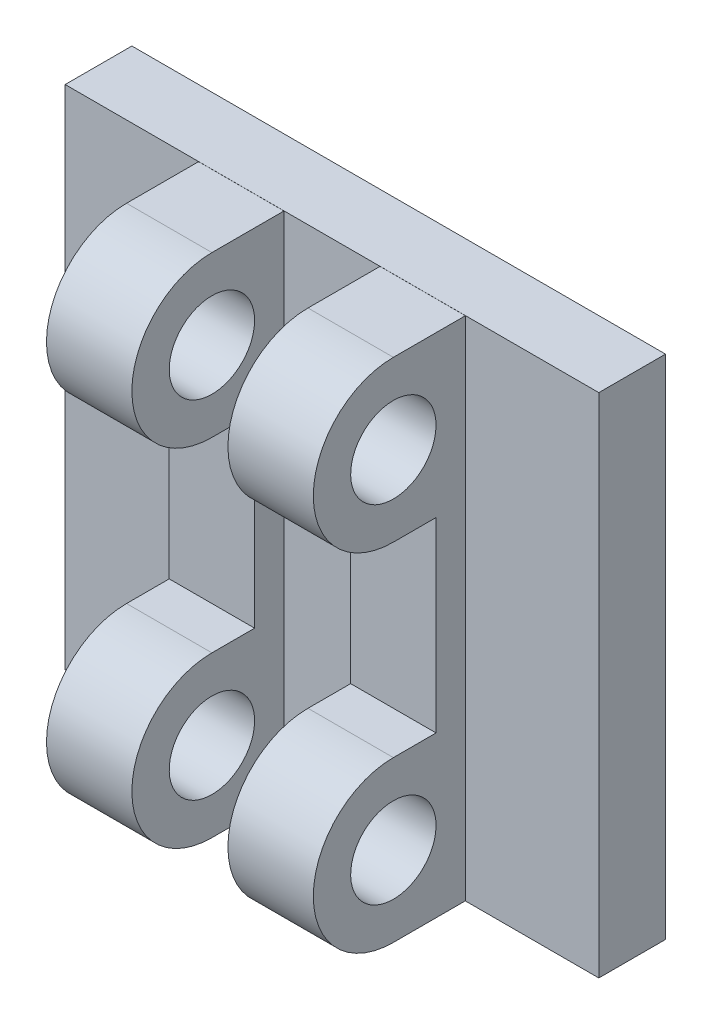
ISO-10303-21;
HEADER;
FILE_DESCRIPTION(('STEP AP214'),'2;1');
FILE_NAME('part.step','',(''),(''),'','','');
FILE_SCHEMA(('AUTOMOTIVE_DESIGN { 1 0 10303 214 1 1 1 1 }'));
ENDSEC;
DATA;
#1=APPLICATION_CONTEXT('core data for automotive mechanical design processes');
#2=APPLICATION_PROTOCOL_DEFINITION('international standard','automotive_design',2000,#1);
#3=PRODUCT_CONTEXT('',#1,'mechanical');
#4=PRODUCT('Part','Part','',(#3));
#5=PRODUCT_RELATED_PRODUCT_CATEGORY('part','',(#4));
#6=PRODUCT_DEFINITION_FORMATION('','',#4);
#7=PRODUCT_DEFINITION_CONTEXT('part definition',#1,'design');
#8=PRODUCT_DEFINITION('design','',#6,#7);
#9=PRODUCT_DEFINITION_SHAPE('','',#8);
#10=(LENGTH_UNIT() NAMED_UNIT(*) SI_UNIT(.MILLI.,.METRE.));
#11=(NAMED_UNIT(*) PLANE_ANGLE_UNIT() SI_UNIT($,.RADIAN.));
#12=(NAMED_UNIT(*) SI_UNIT($,.STERADIAN.) SOLID_ANGLE_UNIT());
#13=UNCERTAINTY_MEASURE_WITH_UNIT(LENGTH_MEASURE(1.E-05),#10,'distance_accuracy_value','');
#14=(GEOMETRIC_REPRESENTATION_CONTEXT(3) GLOBAL_UNCERTAINTY_ASSIGNED_CONTEXT((#13)) GLOBAL_UNIT_ASSIGNED_CONTEXT((#10,
#11,#12)) REPRESENTATION_CONTEXT('',''));
#15=CARTESIAN_POINT('',(0.,0.,0.));
#16=DIRECTION('',(0.,0.,1.));
#17=DIRECTION('',(1.,0.,0.));
#18=AXIS2_PLACEMENT_3D('',#15,#16,#17);
#19=CARTESIAN_POINT('',(12.7,-12.05992,0.));
#20=DIRECTION('',(0.,1.,0.));
#21=DIRECTION('',(0.,0.,1.));
#22=AXIS2_PLACEMENT_3D('',#19,#20,#21);
#23=PLANE('',#22);
#24=DIRECTION('',(-1.,0.,0.));
#25=VECTOR('',#24,1.);
#26=CARTESIAN_POINT('',(12.7,-12.05992,6.35));
#27=LINE('',#26,#25);
#28=CARTESIAN_POINT('',(6.35,-12.05992,6.35));
#29=VERTEX_POINT('',#28);
#30=CARTESIAN_POINT('',(2.28600000000001,-12.05992,6.35));
#31=VERTEX_POINT('',#30);
#32=EDGE_CURVE('E63',#29,#31,#27,.T.);
#33=ORIENTED_EDGE('',*,*,#32,.F.);
#34=DIRECTION('',(0.,0.,-1.));
#35=VECTOR('',#34,1.);
#36=CARTESIAN_POINT('',(6.35,-12.05992,0.));
#37=LINE('',#36,#35);
#38=CARTESIAN_POINT('',(6.35,-12.05992,9.779));
#39=VERTEX_POINT('',#38);
#40=EDGE_CURVE('E291',#39,#29,#37,.T.);
#41=ORIENTED_EDGE('',*,*,#40,.F.);
#42=DIRECTION('',(-1.,0.,0.));
#43=VECTOR('',#42,1.);
#44=CARTESIAN_POINT('',(12.7,-12.05992,9.779));
#45=LINE('',#44,#43);
#46=CARTESIAN_POINT('',(2.28600000000001,-12.05992,9.779));
#47=VERTEX_POINT('',#46);
#48=EDGE_CURVE('E382',#39,#47,#45,.T.);
#49=ORIENTED_EDGE('',*,*,#48,.T.);
#50=DIRECTION('',(0.,0.,-1.));
#51=VECTOR('',#50,1.);
#52=CARTESIAN_POINT('',(2.28600000000001,-12.05992,15.24));
#53=LINE('',#52,#51);
#54=EDGE_CURVE('E240',#47,#31,#53,.T.);
#55=ORIENTED_EDGE('',*,*,#54,.T.);
#56=EDGE_LOOP('',(#33,#41,#49,#55));
#57=FACE_BOUND('',#56,.T.);
#58=ADVANCED_FACE('F39',(#57),#23,.F.);
#59=CARTESIAN_POINT('',(12.7,12.05992,0.));
#60=DIRECTION('',(0.,1.,0.));
#61=DIRECTION('',(0.,0.,1.));
#62=AXIS2_PLACEMENT_3D('',#59,#60,#61);
#63=PLANE('',#62);
#64=DIRECTION('',(0.,0.,-1.));
#65=VECTOR('',#64,1.);
#66=CARTESIAN_POINT('',(6.35,12.05992,15.24));
#67=LINE('',#66,#65);
#68=CARTESIAN_POINT('',(6.35,12.05992,9.779));
#69=VERTEX_POINT('',#68);
#70=CARTESIAN_POINT('',(6.35,12.05992,6.35));
#71=VERTEX_POINT('',#70);
#72=EDGE_CURVE('E228',#69,#71,#67,.T.);
#73=ORIENTED_EDGE('',*,*,#72,.T.);
#74=DIRECTION('',(-1.,0.,0.));
#75=VECTOR('',#74,1.);
#76=CARTESIAN_POINT('',(12.7,12.05992,6.35));
#77=LINE('',#76,#75);
#78=CARTESIAN_POINT('',(2.286,12.05992,6.35));
#79=VERTEX_POINT('',#78);
#80=EDGE_CURVE('E433',#71,#79,#77,.T.);
#81=ORIENTED_EDGE('',*,*,#80,.T.);
#82=DIRECTION('',(0.,0.,-1.));
#83=VECTOR('',#82,1.);
#84=CARTESIAN_POINT('',(2.286,12.05992,15.24));
#85=LINE('',#84,#83);
#86=CARTESIAN_POINT('',(2.286,12.05992,9.779));
#87=VERTEX_POINT('',#86);
#88=EDGE_CURVE('E236',#87,#79,#85,.T.);
#89=ORIENTED_EDGE('',*,*,#88,.F.);
#90=DIRECTION('',(-1.,0.,0.));
#91=VECTOR('',#90,1.);
#92=CARTESIAN_POINT('',(12.7,12.05992,9.779));
#93=LINE('',#92,#91);
#94=EDGE_CURVE('E385',#69,#87,#93,.T.);
#95=ORIENTED_EDGE('',*,*,#94,.F.);
#96=EDGE_LOOP('',(#73,#81,#89,#95));
#97=FACE_BOUND('',#96,.T.);
#98=ADVANCED_FACE('F443',(#97),#63,.T.);
#99=CARTESIAN_POINT('',(6.35,12.05992,15.24));
#100=DIRECTION('',(1.,0.,0.));
#101=DIRECTION('',(0.,1.,0.));
#102=AXIS2_PLACEMENT_3D('',#99,#100,#101);
#103=PLANE('',#102);
#104=CARTESIAN_POINT('',(6.35,-8.24992,9.779));
#105=DIRECTION('',(1.,0.,0.));
#106=DIRECTION('',(0.,1.,0.));
#107=AXIS2_PLACEMENT_3D('',#104,#105,#106);
#108=CIRCLE('',#107,2.032);
#109=CARTESIAN_POINT('',(6.35,-6.21792,9.779));
#110=VERTEX_POINT('',#109);
#111=EDGE_CURVE('E295',#110,#110,#108,.F.);
#112=ORIENTED_EDGE('',*,*,#111,.T.);
#113=EDGE_LOOP('',(#112));
#114=FACE_BOUND('',#113,.T.);
#115=CARTESIAN_POINT('',(6.35,8.24992,9.779));
#116=DIRECTION('',(1.,0.,0.));
#117=DIRECTION('',(0.,1.,0.));
#118=AXIS2_PLACEMENT_3D('',#115,#116,#117);
#119=CIRCLE('',#118,2.032);
#120=CARTESIAN_POINT('',(6.35,10.28192,9.779));
#121=VERTEX_POINT('',#120);
#122=EDGE_CURVE('E301',#121,#121,#119,.F.);
#123=ORIENTED_EDGE('',*,*,#122,.T.);
#124=EDGE_LOOP('',(#123));
#125=FACE_BOUND('',#124,.T.);
#126=ORIENTED_EDGE('',*,*,#40,.T.);
#127=DIRECTION('',(0.,1.,0.));
#128=VECTOR('',#127,1.);
#129=CARTESIAN_POINT('',(6.35,12.05992,6.35));
#130=LINE('',#129,#128);
#131=EDGE_CURVE('E233',#29,#71,#130,.T.);
#132=ORIENTED_EDGE('',*,*,#131,.T.);
#133=ORIENTED_EDGE('',*,*,#72,.F.);
#134=CARTESIAN_POINT('',(6.35,8.24992,9.779));
#135=DIRECTION('',(1.,0.,0.));
#136=DIRECTION('',(0.,1.,0.));
#137=AXIS2_PLACEMENT_3D('',#134,#135,#136);
#138=CIRCLE('',#137,3.81);
#139=CARTESIAN_POINT('',(6.35,4.43992,9.779));
#140=VERTEX_POINT('',#139);
#141=EDGE_CURVE('E198',#140,#69,#138,.F.);
#142=ORIENTED_EDGE('',*,*,#141,.F.);
#143=DIRECTION('',(0.,0.,-1.));
#144=VECTOR('',#143,1.);
#145=CARTESIAN_POINT('',(6.35,4.43992,0.));
#146=LINE('',#145,#144);
#147=CARTESIAN_POINT('',(6.35,4.43992,7.747));
#148=VERTEX_POINT('',#147);
#149=EDGE_CURVE('E268',#140,#148,#146,.T.);
#150=ORIENTED_EDGE('',*,*,#149,.T.);
#151=DIRECTION('',(0.,-1.,0.));
#152=VECTOR('',#151,1.);
#153=CARTESIAN_POINT('',(6.35,0.,7.747));
#154=LINE('',#153,#152);
#155=CARTESIAN_POINT('',(6.35,-4.43992,7.747));
#156=VERTEX_POINT('',#155);
#157=EDGE_CURVE('E274',#148,#156,#154,.T.);
#158=ORIENTED_EDGE('',*,*,#157,.T.);
#159=DIRECTION('',(0.,0.,1.));
#160=VECTOR('',#159,1.);
#161=CARTESIAN_POINT('',(6.35,-4.43992000000001,0.));
#162=LINE('',#161,#160);
#163=CARTESIAN_POINT('',(6.35,-4.43992,9.779));
#164=VERTEX_POINT('',#163);
#165=EDGE_CURVE('E280',#156,#164,#162,.T.);
#166=ORIENTED_EDGE('',*,*,#165,.T.);
#167=CARTESIAN_POINT('',(6.35,-8.24992,9.779));
#168=DIRECTION('',(1.,0.,0.));
#169=DIRECTION('',(0.,1.,0.));
#170=AXIS2_PLACEMENT_3D('',#167,#168,#169);
#171=CIRCLE('',#170,3.81);
#172=EDGE_CURVE('E287',#39,#164,#171,.F.);
#173=ORIENTED_EDGE('',*,*,#172,.F.);
#174=EDGE_LOOP('',(#126,#132,#133,#142,#150,#158,#166,#173));
#175=FACE_BOUND('',#174,.T.);
#176=ADVANCED_FACE('F439',(#114,#125,#175),#103,.T.);
#177=CARTESIAN_POINT('',(2.286,12.05992,15.24));
#178=DIRECTION('',(-1.,0.,0.));
#179=DIRECTION('',(0.,-1.,0.));
#180=AXIS2_PLACEMENT_3D('',#177,#178,#179);
#181=PLANE('',#180);
#182=CARTESIAN_POINT('',(2.286,-8.24992,9.779));
#183=DIRECTION('',(-1.,0.,0.));
#184=DIRECTION('',(0.,-1.,0.));
#185=AXIS2_PLACEMENT_3D('',#182,#183,#184);
#186=CIRCLE('',#185,2.032);
#187=CARTESIAN_POINT('',(2.28600000000001,-10.28192,9.779));
#188=VERTEX_POINT('',#187);
#189=EDGE_CURVE('E318',#188,#188,#186,.F.);
#190=ORIENTED_EDGE('',*,*,#189,.T.);
#191=EDGE_LOOP('',(#190));
#192=FACE_BOUND('',#191,.T.);
#193=CARTESIAN_POINT('',(2.286,8.24992,9.779));
#194=DIRECTION('',(-1.,0.,0.));
#195=DIRECTION('',(0.,-1.,0.));
#196=AXIS2_PLACEMENT_3D('',#193,#194,#195);
#197=CIRCLE('',#196,2.032);
#198=CARTESIAN_POINT('',(2.286,6.21792,9.779));
#199=VERTEX_POINT('',#198);
#200=EDGE_CURVE('E322',#199,#199,#197,.F.);
#201=ORIENTED_EDGE('',*,*,#200,.T.);
#202=EDGE_LOOP('',(#201));
#203=FACE_BOUND('',#202,.T.);
#204=ORIENTED_EDGE('',*,*,#88,.T.);
#205=DIRECTION('',(0.,-1.,0.));
#206=VECTOR('',#205,1.);
#207=CARTESIAN_POINT('',(2.286,12.05992,6.35));
#208=LINE('',#207,#206);
#209=EDGE_CURVE('E430',#79,#31,#208,.T.);
#210=ORIENTED_EDGE('',*,*,#209,.T.);
#211=ORIENTED_EDGE('',*,*,#54,.F.);
#212=CARTESIAN_POINT('',(2.286,-8.24992,9.779));
#213=DIRECTION('',(-1.,0.,0.));
#214=DIRECTION('',(0.,-1.,0.));
#215=AXIS2_PLACEMENT_3D('',#212,#213,#214);
#216=CIRCLE('',#215,3.81);
#217=CARTESIAN_POINT('',(2.286,-4.43992,9.779));
#218=VERTEX_POINT('',#217);
#219=EDGE_CURVE('E314',#218,#47,#216,.F.);
#220=ORIENTED_EDGE('',*,*,#219,.F.);
#221=DIRECTION('',(0.,0.,-1.));
#222=VECTOR('',#221,1.);
#223=CARTESIAN_POINT('',(2.286,-4.43992000000001,0.));
#224=LINE('',#223,#222);
#225=CARTESIAN_POINT('',(2.286,-4.43992,7.747));
#226=VERTEX_POINT('',#225);
#227=EDGE_CURVE('E311',#218,#226,#224,.T.);
#228=ORIENTED_EDGE('',*,*,#227,.T.);
#229=DIRECTION('',(0.,1.,0.));
#230=VECTOR('',#229,1.);
#231=CARTESIAN_POINT('',(2.286,0.,7.747));
#232=LINE('',#231,#230);
#233=CARTESIAN_POINT('',(2.286,4.43992,7.747));
#234=VERTEX_POINT('',#233);
#235=EDGE_CURVE('E308',#226,#234,#232,.T.);
#236=ORIENTED_EDGE('',*,*,#235,.T.);
#237=DIRECTION('',(0.,0.,1.));
#238=VECTOR('',#237,1.);
#239=CARTESIAN_POINT('',(2.286,4.43992,0.));
#240=LINE('',#239,#238);
#241=CARTESIAN_POINT('',(2.286,4.43992,9.779));
#242=VERTEX_POINT('',#241);
#243=EDGE_CURVE('E305',#234,#242,#240,.T.);
#244=ORIENTED_EDGE('',*,*,#243,.T.);
#245=CARTESIAN_POINT('',(2.286,8.24992,9.779));
#246=DIRECTION('',(-1.,0.,0.));
#247=DIRECTION('',(0.,-1.,0.));
#248=AXIS2_PLACEMENT_3D('',#245,#246,#247);
#249=CIRCLE('',#248,3.81);
#250=EDGE_CURVE('E204',#87,#242,#249,.F.);
#251=ORIENTED_EDGE('',*,*,#250,.F.);
#252=EDGE_LOOP('',(#204,#210,#211,#220,#228,#236,#244,#251));
#253=FACE_BOUND('',#252,.T.);
#254=ADVANCED_FACE('F466',(#192,#203,#253),#181,.T.);
#255=CARTESIAN_POINT('',(12.7,4.43992,0.));
#256=DIRECTION('',(0.,1.,0.));
#257=DIRECTION('',(0.,0.,1.));
#258=AXIS2_PLACEMENT_3D('',#255,#256,#257);
#259=PLANE('',#258);
#260=ORIENTED_EDGE('',*,*,#243,.F.);
#261=DIRECTION('',(-1.,0.,0.));
#262=VECTOR('',#261,1.);
#263=CARTESIAN_POINT('',(12.7,4.43992,7.747));
#264=LINE('',#263,#262);
#265=EDGE_CURVE('E216',#148,#234,#264,.T.);
#266=ORIENTED_EDGE('',*,*,#265,.F.);
#267=ORIENTED_EDGE('',*,*,#149,.F.);
#268=DIRECTION('',(-1.,0.,0.));
#269=VECTOR('',#268,1.);
#270=CARTESIAN_POINT('',(12.7,4.43992,9.779));
#271=LINE('',#270,#269);
#272=EDGE_CURVE('E389',#140,#242,#271,.T.);
#273=ORIENTED_EDGE('',*,*,#272,.T.);
#274=EDGE_LOOP('',(#260,#266,#267,#273));
#275=FACE_BOUND('',#274,.T.);
#276=ADVANCED_FACE('F448',(#275),#259,.F.);
#277=CARTESIAN_POINT('',(12.7,0.,7.747));
#278=DIRECTION('',(0.,0.,-1.));
#279=DIRECTION('',(0.,1.,0.));
#280=AXIS2_PLACEMENT_3D('',#277,#278,#279);
#281=PLANE('',#280);
#282=ORIENTED_EDGE('',*,*,#235,.F.);
#283=DIRECTION('',(-1.,0.,0.));
#284=VECTOR('',#283,1.);
#285=CARTESIAN_POINT('',(12.7,-4.43992,7.747));
#286=LINE('',#285,#284);
#287=EDGE_CURVE('E372',#156,#226,#286,.T.);
#288=ORIENTED_EDGE('',*,*,#287,.F.);
#289=ORIENTED_EDGE('',*,*,#157,.F.);
#290=ORIENTED_EDGE('',*,*,#265,.T.);
#291=EDGE_LOOP('',(#282,#288,#289,#290));
#292=FACE_BOUND('',#291,.T.);
#293=ADVANCED_FACE('F471',(#292),#281,.F.);
#294=CARTESIAN_POINT('',(12.7,-4.43992000000001,0.));
#295=DIRECTION('',(0.,-1.,0.));
#296=DIRECTION('',(0.,0.,-1.));
#297=AXIS2_PLACEMENT_3D('',#294,#295,#296);
#298=PLANE('',#297);
#299=ORIENTED_EDGE('',*,*,#227,.F.);
#300=DIRECTION('',(-1.,0.,0.));
#301=VECTOR('',#300,1.);
#302=CARTESIAN_POINT('',(12.7,-4.43992,9.779));
#303=LINE('',#302,#301);
#304=EDGE_CURVE('E377',#164,#218,#303,.T.);
#305=ORIENTED_EDGE('',*,*,#304,.F.);
#306=ORIENTED_EDGE('',*,*,#165,.F.);
#307=ORIENTED_EDGE('',*,*,#287,.T.);
#308=EDGE_LOOP('',(#299,#305,#306,#307));
#309=FACE_BOUND('',#308,.T.);
#310=ADVANCED_FACE('F468',(#309),#298,.F.);
#311=CARTESIAN_POINT('',(12.7,-8.24992,9.779));
#312=DIRECTION('',(-1.,0.,0.));
#313=DIRECTION('',(0.,0.,1.));
#314=AXIS2_PLACEMENT_3D('',#311,#312,#313);
#315=CYLINDRICAL_SURFACE('',#314,3.81);
#316=ORIENTED_EDGE('',*,*,#304,.T.);
#317=ORIENTED_EDGE('',*,*,#219,.T.);
#318=ORIENTED_EDGE('',*,*,#48,.F.);
#319=ORIENTED_EDGE('',*,*,#172,.T.);
#320=EDGE_LOOP('',(#316,#317,#318,#319));
#321=FACE_BOUND('',#320,.T.);
#322=ADVANCED_FACE('F462',(#321),#315,.T.);
#323=CARTESIAN_POINT('',(12.7,8.24992,9.779));
#324=DIRECTION('',(-1.,0.,0.));
#325=DIRECTION('',(0.,0.,1.));
#326=AXIS2_PLACEMENT_3D('',#323,#324,#325);
#327=CYLINDRICAL_SURFACE('',#326,3.81);
#328=ORIENTED_EDGE('',*,*,#94,.T.);
#329=ORIENTED_EDGE('',*,*,#250,.T.);
#330=ORIENTED_EDGE('',*,*,#272,.F.);
#331=ORIENTED_EDGE('',*,*,#141,.T.);
#332=EDGE_LOOP('',(#328,#329,#330,#331));
#333=FACE_BOUND('',#332,.T.);
#334=ADVANCED_FACE('F446',(#333),#327,.T.);
#335=CARTESIAN_POINT('',(12.7,-8.24992,9.779));
#336=DIRECTION('',(-1.,0.,0.));
#337=DIRECTION('',(0.,0.,1.));
#338=AXIS2_PLACEMENT_3D('',#335,#336,#337);
#339=CYLINDRICAL_SURFACE('',#338,2.032);
#340=ORIENTED_EDGE('',*,*,#111,.F.);
#341=EDGE_LOOP('',(#340));
#342=FACE_BOUND('',#341,.T.);
#343=ORIENTED_EDGE('',*,*,#189,.F.);
#344=EDGE_LOOP('',(#343));
#345=FACE_BOUND('',#344,.T.);
#346=ADVANCED_FACE('F561',(#342,#345),#339,.F.);
#347=CARTESIAN_POINT('',(12.7,8.24992,9.779));
#348=DIRECTION('',(-1.,0.,0.));
#349=DIRECTION('',(0.,0.,1.));
#350=AXIS2_PLACEMENT_3D('',#347,#348,#349);
#351=CYLINDRICAL_SURFACE('',#350,2.032);
#352=ORIENTED_EDGE('',*,*,#122,.F.);
#353=EDGE_LOOP('',(#352));
#354=FACE_BOUND('',#353,.T.);
#355=ORIENTED_EDGE('',*,*,#200,.F.);
#356=EDGE_LOOP('',(#355));
#357=FACE_BOUND('',#356,.T.);
#358=ADVANCED_FACE('F474',(#354,#357),#351,.F.);
#359=CARTESIAN_POINT('',(0.,0.,6.35));
#360=DIRECTION('',(0.,0.,-1.));
#361=DIRECTION('',(1.,0.,0.));
#362=AXIS2_PLACEMENT_3D('',#359,#360,#361);
#363=PLANE('',#362);
#364=ORIENTED_EDGE('',*,*,#131,.F.);
#365=ORIENTED_EDGE('',*,*,#32,.T.);
#366=ORIENTED_EDGE('',*,*,#209,.F.);
#367=ORIENTED_EDGE('',*,*,#80,.F.);
#368=EDGE_LOOP('',(#364,#365,#366,#367));
#369=FACE_BOUND('',#368,.T.);
#370=DIRECTION('',(0.,1.,0.));
#371=VECTOR('',#370,1.);
#372=CARTESIAN_POINT('',(-2.286,12.05992,6.35));
#373=LINE('',#372,#371);
#374=CARTESIAN_POINT('',(-2.28600000000001,-12.05992,6.35));
#375=VERTEX_POINT('',#374);
#376=CARTESIAN_POINT('',(-2.286,12.05992,6.35));
#377=VERTEX_POINT('',#376);
#378=EDGE_CURVE('E422',#375,#377,#373,.T.);
#379=ORIENTED_EDGE('',*,*,#378,.F.);
#380=DIRECTION('',(-1.,0.,0.));
#381=VECTOR('',#380,1.);
#382=CARTESIAN_POINT('',(12.7,-12.05992,6.35));
#383=LINE('',#382,#381);
#384=CARTESIAN_POINT('',(-6.35,-12.05992,6.35));
#385=VERTEX_POINT('',#384);
#386=EDGE_CURVE('E418',#375,#385,#383,.T.);
#387=ORIENTED_EDGE('',*,*,#386,.T.);
#388=DIRECTION('',(0.,-1.,0.));
#389=VECTOR('',#388,1.);
#390=CARTESIAN_POINT('',(-6.35,12.05992,6.35));
#391=LINE('',#390,#389);
#392=CARTESIAN_POINT('',(-6.35,12.05992,6.35));
#393=VERTEX_POINT('',#392);
#394=EDGE_CURVE('E11',#393,#385,#391,.T.);
#395=ORIENTED_EDGE('',*,*,#394,.F.);
#396=DIRECTION('',(-1.,0.,0.));
#397=VECTOR('',#396,1.);
#398=CARTESIAN_POINT('',(12.7,12.05992,6.35));
#399=LINE('',#398,#397);
#400=EDGE_CURVE('E414',#377,#393,#399,.T.);
#401=ORIENTED_EDGE('',*,*,#400,.F.);
#402=EDGE_LOOP('',(#379,#387,#395,#401));
#403=FACE_BOUND('',#402,.T.);
#404=DIRECTION('',(0.,-1.,0.));
#405=VECTOR('',#404,1.);
#406=CARTESIAN_POINT('',(-12.7,12.065,6.35));
#407=LINE('',#406,#405);
#408=CARTESIAN_POINT('',(-12.7,12.065,6.35));
#409=VERTEX_POINT('',#408);
#410=CARTESIAN_POINT('',(-12.7,-12.065,6.35));
#411=VERTEX_POINT('',#410);
#412=EDGE_CURVE('E478',#409,#411,#407,.T.);
#413=ORIENTED_EDGE('',*,*,#412,.T.);
#414=DIRECTION('',(1.,0.,0.));
#415=VECTOR('',#414,1.);
#416=CARTESIAN_POINT('',(-12.7,-12.065,6.35));
#417=LINE('',#416,#415);
#418=CARTESIAN_POINT('',(12.7,-12.065,6.35));
#419=VERTEX_POINT('',#418);
#420=EDGE_CURVE('E196',#411,#419,#417,.T.);
#421=ORIENTED_EDGE('',*,*,#420,.T.);
#422=DIRECTION('',(0.,1.,0.));
#423=VECTOR('',#422,1.);
#424=CARTESIAN_POINT('',(12.7,12.065,6.35));
#425=LINE('',#424,#423);
#426=CARTESIAN_POINT('',(12.7,12.065,6.35));
#427=VERTEX_POINT('',#426);
#428=EDGE_CURVE('E424',#419,#427,#425,.T.);
#429=ORIENTED_EDGE('',*,*,#428,.T.);
#430=DIRECTION('',(-1.,0.,0.));
#431=VECTOR('',#430,1.);
#432=CARTESIAN_POINT('',(-12.7,12.065,6.35));
#433=LINE('',#432,#431);
#434=EDGE_CURVE('E481',#427,#409,#433,.T.);
#435=ORIENTED_EDGE('',*,*,#434,.T.);
#436=EDGE_LOOP('',(#413,#421,#429,#435));
#437=FACE_BOUND('',#436,.T.);
#438=ADVANCED_FACE('F472',(#369,#403,#437),#363,.F.);
#439=CARTESIAN_POINT('',(-12.7,-12.065,3.175));
#440=DIRECTION('',(0.,1.,0.));
#441=DIRECTION('',(0.,0.,1.));
#442=AXIS2_PLACEMENT_3D('',#439,#440,#441);
#443=PLANE('',#442);
#444=DIRECTION('',(0.,0.,-1.));
#445=VECTOR('',#444,1.);
#446=CARTESIAN_POINT('',(-12.7,-12.065,3.175));
#447=LINE('',#446,#445);
#448=CARTESIAN_POINT('',(-12.7,-12.065,3.175));
#449=VERTEX_POINT('',#448);
#450=EDGE_CURVE('E188',#411,#449,#447,.T.);
#451=ORIENTED_EDGE('',*,*,#450,.T.);
#452=DIRECTION('',(1.,0.,0.));
#453=VECTOR('',#452,1.);
#454=CARTESIAN_POINT('',(-12.7,-12.065,3.175));
#455=LINE('',#454,#453);
#456=CARTESIAN_POINT('',(12.7,-12.065,3.175));
#457=VERTEX_POINT('',#456);
#458=EDGE_CURVE('E175',#449,#457,#455,.T.);
#459=ORIENTED_EDGE('',*,*,#458,.T.);
#460=DIRECTION('',(0.,0.,-1.));
#461=VECTOR('',#460,1.);
#462=CARTESIAN_POINT('',(12.7,-12.065,3.175));
#463=LINE('',#462,#461);
#464=EDGE_CURVE('E199',#419,#457,#463,.T.);
#465=ORIENTED_EDGE('',*,*,#464,.F.);
#466=ORIENTED_EDGE('',*,*,#420,.F.);
#467=EDGE_LOOP('',(#451,#459,#465,#466));
#468=FACE_BOUND('',#467,.T.);
#469=ADVANCED_FACE('F194',(#468),#443,.F.);
#470=CARTESIAN_POINT('',(-12.7,12.065,3.175));
#471=DIRECTION('',(0.,-1.,0.));
#472=DIRECTION('',(0.,0.,-1.));
#473=AXIS2_PLACEMENT_3D('',#470,#471,#472);
#474=PLANE('',#473);
#475=DIRECTION('',(0.,0.,-1.));
#476=VECTOR('',#475,1.);
#477=CARTESIAN_POINT('',(12.7,12.065,3.175));
#478=LINE('',#477,#476);
#479=CARTESIAN_POINT('',(12.7,12.065,3.175));
#480=VERTEX_POINT('',#479);
#481=EDGE_CURVE('E206',#427,#480,#478,.T.);
#482=ORIENTED_EDGE('',*,*,#481,.T.);
#483=DIRECTION('',(1.,0.,0.));
#484=VECTOR('',#483,1.);
#485=CARTESIAN_POINT('',(-12.7,12.065,3.175));
#486=LINE('',#485,#484);
#487=CARTESIAN_POINT('',(-12.7,12.065,3.175));
#488=VERTEX_POINT('',#487);
#489=EDGE_CURVE('E55',#488,#480,#486,.T.);
#490=ORIENTED_EDGE('',*,*,#489,.F.);
#491=DIRECTION('',(0.,0.,-1.));
#492=VECTOR('',#491,1.);
#493=CARTESIAN_POINT('',(-12.7,12.065,3.175));
#494=LINE('',#493,#492);
#495=EDGE_CURVE('E190',#409,#488,#494,.T.);
#496=ORIENTED_EDGE('',*,*,#495,.F.);
#497=ORIENTED_EDGE('',*,*,#434,.F.);
#498=EDGE_LOOP('',(#482,#490,#496,#497));
#499=FACE_BOUND('',#498,.T.);
#500=ADVANCED_FACE('F493',(#499),#474,.F.);
#501=CARTESIAN_POINT('',(-12.7,12.065,3.175));
#502=DIRECTION('',(1.,0.,0.));
#503=DIRECTION('',(0.,0.,-1.));
#504=AXIS2_PLACEMENT_3D('',#501,#502,#503);
#505=PLANE('',#504);
#506=ORIENTED_EDGE('',*,*,#495,.T.);
#507=DIRECTION('',(0.,-1.,0.));
#508=VECTOR('',#507,1.);
#509=CARTESIAN_POINT('',(-12.7,12.065,3.175));
#510=LINE('',#509,#508);
#511=EDGE_CURVE('E178',#488,#449,#510,.T.);
#512=ORIENTED_EDGE('',*,*,#511,.T.);
#513=ORIENTED_EDGE('',*,*,#450,.F.);
#514=ORIENTED_EDGE('',*,*,#412,.F.);
#515=EDGE_LOOP('',(#506,#512,#513,#514));
#516=FACE_BOUND('',#515,.T.);
#517=ADVANCED_FACE('F41',(#516),#505,.F.);
#518=CARTESIAN_POINT('',(12.7,12.065,3.175));
#519=DIRECTION('',(-1.,0.,0.));
#520=DIRECTION('',(0.,0.,1.));
#521=AXIS2_PLACEMENT_3D('',#518,#519,#520);
#522=PLANE('',#521);
#523=ORIENTED_EDGE('',*,*,#464,.T.);
#524=DIRECTION('',(0.,-1.,0.));
#525=VECTOR('',#524,1.);
#526=CARTESIAN_POINT('',(12.7,12.065,3.175));
#527=LINE('',#526,#525);
#528=EDGE_CURVE('E179',#480,#457,#527,.T.);
#529=ORIENTED_EDGE('',*,*,#528,.F.);
#530=ORIENTED_EDGE('',*,*,#481,.F.);
#531=ORIENTED_EDGE('',*,*,#428,.F.);
#532=EDGE_LOOP('',(#523,#529,#530,#531));
#533=FACE_BOUND('',#532,.T.);
#534=ADVANCED_FACE('F491',(#533),#522,.F.);
#535=CARTESIAN_POINT('',(-2.286,12.05992,9.779));
#536=VERTEX_POINT('',#535);
#537=CARTESIAN_POINT('',(-6.35,12.05992,9.779));
#538=VERTEX_POINT('',#537);
#539=EDGE_CURVE('E386',#536,#538,#93,.T.);
#540=ORIENTED_EDGE('',*,*,#539,.T.);
#541=CARTESIAN_POINT('',(-6.35,8.24992,9.779));
#542=DIRECTION('',(-1.,0.,0.));
#543=DIRECTION('',(0.,-1.,0.));
#544=AXIS2_PLACEMENT_3D('',#541,#542,#543);
#545=CIRCLE('',#544,3.81);
#546=CARTESIAN_POINT('',(-6.35,4.43992,9.779));
#547=VERTEX_POINT('',#546);
#548=EDGE_CURVE('E48',#538,#547,#545,.F.);
#549=ORIENTED_EDGE('',*,*,#548,.T.);
#550=CARTESIAN_POINT('',(-2.286,4.43992,9.779));
#551=VERTEX_POINT('',#550);
#552=EDGE_CURVE('E209',#551,#547,#271,.T.);
#553=ORIENTED_EDGE('',*,*,#552,.F.);
#554=CARTESIAN_POINT('',(-2.286,8.24992,9.779));
#555=DIRECTION('',(1.,0.,0.));
#556=DIRECTION('',(0.,1.,0.));
#557=AXIS2_PLACEMENT_3D('',#554,#555,#556);
#558=CIRCLE('',#557,3.81);
#559=EDGE_CURVE('E221',#551,#536,#558,.F.);
#560=ORIENTED_EDGE('',*,*,#559,.T.);
#561=EDGE_LOOP('',(#540,#549,#553,#560));
#562=FACE_BOUND('',#561,.T.);
#563=ADVANCED_FACE('F407',(#562),#327,.T.);
#564=DIRECTION('',(0.,0.,1.));
#565=VECTOR('',#564,1.);
#566=CARTESIAN_POINT('',(-6.35,4.43992,0.));
#567=LINE('',#566,#565);
#568=CARTESIAN_POINT('',(-6.35,4.43992,7.747));
#569=VERTEX_POINT('',#568);
#570=EDGE_CURVE('E347',#569,#547,#567,.T.);
#571=ORIENTED_EDGE('',*,*,#570,.F.);
#572=CARTESIAN_POINT('',(-2.286,4.43992,7.747));
#573=VERTEX_POINT('',#572);
#574=EDGE_CURVE('E368',#573,#569,#264,.T.);
#575=ORIENTED_EDGE('',*,*,#574,.F.);
#576=DIRECTION('',(0.,0.,-1.));
#577=VECTOR('',#576,1.);
#578=CARTESIAN_POINT('',(-2.286,4.43992,0.));
#579=LINE('',#578,#577);
#580=EDGE_CURVE('E326',#551,#573,#579,.T.);
#581=ORIENTED_EDGE('',*,*,#580,.F.);
#582=ORIENTED_EDGE('',*,*,#552,.T.);
#583=EDGE_LOOP('',(#571,#575,#581,#582));
#584=FACE_BOUND('',#583,.T.);
#585=ADVANCED_FACE('F405',(#584),#259,.F.);
#586=DIRECTION('',(0.,1.,0.));
#587=VECTOR('',#586,1.);
#588=CARTESIAN_POINT('',(-6.35,0.,7.747));
#589=LINE('',#588,#587);
#590=CARTESIAN_POINT('',(-6.35,-4.43992,7.747));
#591=VERTEX_POINT('',#590);
#592=EDGE_CURVE('E350',#591,#569,#589,.T.);
#593=ORIENTED_EDGE('',*,*,#592,.F.);
#594=CARTESIAN_POINT('',(-2.286,-4.43992,7.747));
#595=VERTEX_POINT('',#594);
#596=EDGE_CURVE('E373',#595,#591,#286,.T.);
#597=ORIENTED_EDGE('',*,*,#596,.F.);
#598=DIRECTION('',(0.,-1.,0.));
#599=VECTOR('',#598,1.);
#600=CARTESIAN_POINT('',(-2.286,0.,7.747));
#601=LINE('',#600,#599);
#602=EDGE_CURVE('E329',#573,#595,#601,.T.);
#603=ORIENTED_EDGE('',*,*,#602,.F.);
#604=ORIENTED_EDGE('',*,*,#574,.T.);
#605=EDGE_LOOP('',(#593,#597,#603,#604));
#606=FACE_BOUND('',#605,.T.);
#607=ADVANCED_FACE('F532',(#606),#281,.F.);
#608=DIRECTION('',(0.,0.,-1.));
#609=VECTOR('',#608,1.);
#610=CARTESIAN_POINT('',(-6.35,-4.43992000000001,0.));
#611=LINE('',#610,#609);
#612=CARTESIAN_POINT('',(-6.35,-4.43992,9.779));
#613=VERTEX_POINT('',#612);
#614=EDGE_CURVE('E353',#613,#591,#611,.T.);
#615=ORIENTED_EDGE('',*,*,#614,.F.);
#616=CARTESIAN_POINT('',(-2.286,-4.43992,9.779));
#617=VERTEX_POINT('',#616);
#618=EDGE_CURVE('E378',#617,#613,#303,.T.);
#619=ORIENTED_EDGE('',*,*,#618,.F.);
#620=DIRECTION('',(0.,0.,1.));
#621=VECTOR('',#620,1.);
#622=CARTESIAN_POINT('',(-2.286,-4.43992000000001,0.));
#623=LINE('',#622,#621);
#624=EDGE_CURVE('E332',#595,#617,#623,.T.);
#625=ORIENTED_EDGE('',*,*,#624,.F.);
#626=ORIENTED_EDGE('',*,*,#596,.T.);
#627=EDGE_LOOP('',(#615,#619,#625,#626));
#628=FACE_BOUND('',#627,.T.);
#629=ADVANCED_FACE('F528',(#628),#298,.F.);
#630=ORIENTED_EDGE('',*,*,#618,.T.);
#631=CARTESIAN_POINT('',(-6.35,-8.24992,9.779));
#632=DIRECTION('',(-1.,0.,0.));
#633=DIRECTION('',(0.,-1.,0.));
#634=AXIS2_PLACEMENT_3D('',#631,#632,#633);
#635=CIRCLE('',#634,3.81);
#636=CARTESIAN_POINT('',(-6.35,-12.05992,9.779));
#637=VERTEX_POINT('',#636);
#638=EDGE_CURVE('E356',#613,#637,#635,.F.);
#639=ORIENTED_EDGE('',*,*,#638,.T.);
#640=CARTESIAN_POINT('',(-2.28600000000001,-12.05992,9.779));
#641=VERTEX_POINT('',#640);
#642=EDGE_CURVE('E383',#641,#637,#45,.T.);
#643=ORIENTED_EDGE('',*,*,#642,.F.);
#644=CARTESIAN_POINT('',(-2.286,-8.24992,9.779));
#645=DIRECTION('',(1.,0.,0.));
#646=DIRECTION('',(0.,1.,0.));
#647=AXIS2_PLACEMENT_3D('',#644,#645,#646);
#648=CIRCLE('',#647,3.81);
#649=EDGE_CURVE('E335',#641,#617,#648,.F.);
#650=ORIENTED_EDGE('',*,*,#649,.T.);
#651=EDGE_LOOP('',(#630,#639,#643,#650));
#652=FACE_BOUND('',#651,.T.);
#653=ADVANCED_FACE('F525',(#652),#315,.T.);
#654=CARTESIAN_POINT('',(-2.286,8.24992,9.779));
#655=DIRECTION('',(1.,0.,0.));
#656=DIRECTION('',(0.,1.,0.));
#657=AXIS2_PLACEMENT_3D('',#654,#655,#656);
#658=CIRCLE('',#657,2.032);
#659=CARTESIAN_POINT('',(-2.286,10.28192,9.779));
#660=VERTEX_POINT('',#659);
#661=EDGE_CURVE('E343',#660,#660,#658,.F.);
#662=ORIENTED_EDGE('',*,*,#661,.F.);
#663=EDGE_LOOP('',(#662));
#664=FACE_BOUND('',#663,.T.);
#665=CARTESIAN_POINT('',(-6.35,8.24992,9.779));
#666=DIRECTION('',(-1.,0.,0.));
#667=DIRECTION('',(0.,-1.,0.));
#668=AXIS2_PLACEMENT_3D('',#665,#666,#667);
#669=CIRCLE('',#668,2.032);
#670=CARTESIAN_POINT('',(-6.35,6.21792,9.779));
#671=VERTEX_POINT('',#670);
#672=EDGE_CURVE('E364',#671,#671,#669,.F.);
#673=ORIENTED_EDGE('',*,*,#672,.F.);
#674=EDGE_LOOP('',(#673));
#675=FACE_BOUND('',#674,.T.);
#676=ADVANCED_FACE('F555',(#664,#675),#351,.F.);
#677=CARTESIAN_POINT('',(-2.286,-8.24992,9.779));
#678=DIRECTION('',(1.,0.,0.));
#679=DIRECTION('',(0.,1.,0.));
#680=AXIS2_PLACEMENT_3D('',#677,#678,#679);
#681=CIRCLE('',#680,2.032);
#682=CARTESIAN_POINT('',(-2.286,-6.21792,9.779));
#683=VERTEX_POINT('',#682);
#684=EDGE_CURVE('E339',#683,#683,#681,.F.);
#685=ORIENTED_EDGE('',*,*,#684,.F.);
#686=EDGE_LOOP('',(#685));
#687=FACE_BOUND('',#686,.T.);
#688=CARTESIAN_POINT('',(-6.35,-8.24992,9.779));
#689=DIRECTION('',(-1.,0.,0.));
#690=DIRECTION('',(0.,-1.,0.));
#691=AXIS2_PLACEMENT_3D('',#688,#689,#690);
#692=CIRCLE('',#691,2.032);
#693=CARTESIAN_POINT('',(-6.35,-10.28192,9.779));
#694=VERTEX_POINT('',#693);
#695=EDGE_CURVE('E360',#694,#694,#692,.F.);
#696=ORIENTED_EDGE('',*,*,#695,.F.);
#697=EDGE_LOOP('',(#696));
#698=FACE_BOUND('',#697,.T.);
#699=ADVANCED_FACE('F557',(#687,#698),#339,.F.);
#700=CARTESIAN_POINT('',(-6.35,12.05992,15.24));
#701=DIRECTION('',(-1.,0.,0.));
#702=DIRECTION('',(0.,-1.,0.));
#703=AXIS2_PLACEMENT_3D('',#700,#701,#702);
#704=PLANE('',#703);
#705=ORIENTED_EDGE('',*,*,#695,.T.);
#706=EDGE_LOOP('',(#705));
#707=FACE_BOUND('',#706,.T.);
#708=ORIENTED_EDGE('',*,*,#672,.T.);
#709=EDGE_LOOP('',(#708));
#710=FACE_BOUND('',#709,.T.);
#711=DIRECTION('',(0.,0.,-1.));
#712=VECTOR('',#711,1.);
#713=CARTESIAN_POINT('',(-6.35,12.05992,15.24));
#714=LINE('',#713,#712);
#715=EDGE_CURVE('E252',#538,#393,#714,.T.);
#716=ORIENTED_EDGE('',*,*,#715,.T.);
#717=ORIENTED_EDGE('',*,*,#394,.T.);
#718=DIRECTION('',(0.,0.,-1.));
#719=VECTOR('',#718,1.);
#720=CARTESIAN_POINT('',(-6.35,-12.05992,15.24));
#721=LINE('',#720,#719);
#722=EDGE_CURVE('E263',#637,#385,#721,.T.);
#723=ORIENTED_EDGE('',*,*,#722,.F.);
#724=ORIENTED_EDGE('',*,*,#638,.F.);
#725=ORIENTED_EDGE('',*,*,#614,.T.);
#726=ORIENTED_EDGE('',*,*,#592,.T.);
#727=ORIENTED_EDGE('',*,*,#570,.T.);
#728=ORIENTED_EDGE('',*,*,#548,.F.);
#729=EDGE_LOOP('',(#716,#717,#723,#724,#725,#726,#727,#728));
#730=FACE_BOUND('',#729,.T.);
#731=ADVANCED_FACE('F410',(#707,#710,#730),#704,.T.);
#732=CARTESIAN_POINT('',(-2.286,12.05992,15.24));
#733=DIRECTION('',(1.,0.,0.));
#734=DIRECTION('',(0.,1.,0.));
#735=AXIS2_PLACEMENT_3D('',#732,#733,#734);
#736=PLANE('',#735);
#737=ORIENTED_EDGE('',*,*,#684,.T.);
#738=EDGE_LOOP('',(#737));
#739=FACE_BOUND('',#738,.T.);
#740=ORIENTED_EDGE('',*,*,#661,.T.);
#741=EDGE_LOOP('',(#740));
#742=FACE_BOUND('',#741,.T.);
#743=DIRECTION('',(0.,0.,-1.));
#744=VECTOR('',#743,1.);
#745=CARTESIAN_POINT('',(-2.28600000000001,-12.05992,15.24));
#746=LINE('',#745,#744);
#747=EDGE_CURVE('E248',#641,#375,#746,.T.);
#748=ORIENTED_EDGE('',*,*,#747,.T.);
#749=ORIENTED_EDGE('',*,*,#378,.T.);
#750=DIRECTION('',(0.,0.,-1.));
#751=VECTOR('',#750,1.);
#752=CARTESIAN_POINT('',(-2.286,12.05992,15.24));
#753=LINE('',#752,#751);
#754=EDGE_CURVE('E232',#536,#377,#753,.T.);
#755=ORIENTED_EDGE('',*,*,#754,.F.);
#756=ORIENTED_EDGE('',*,*,#559,.F.);
#757=ORIENTED_EDGE('',*,*,#580,.T.);
#758=ORIENTED_EDGE('',*,*,#602,.T.);
#759=ORIENTED_EDGE('',*,*,#624,.T.);
#760=ORIENTED_EDGE('',*,*,#649,.F.);
#761=EDGE_LOOP('',(#748,#749,#755,#756,#757,#758,#759,#760));
#762=FACE_BOUND('',#761,.T.);
#763=ADVANCED_FACE('F518',(#739,#742,#762),#736,.T.);
#764=ORIENTED_EDGE('',*,*,#754,.T.);
#765=ORIENTED_EDGE('',*,*,#400,.T.);
#766=ORIENTED_EDGE('',*,*,#715,.F.);
#767=ORIENTED_EDGE('',*,*,#539,.F.);
#768=EDGE_LOOP('',(#764,#765,#766,#767));
#769=FACE_BOUND('',#768,.T.);
#770=ADVANCED_FACE('F413',(#769),#63,.T.);
#771=ORIENTED_EDGE('',*,*,#386,.F.);
#772=ORIENTED_EDGE('',*,*,#747,.F.);
#773=ORIENTED_EDGE('',*,*,#642,.T.);
#774=ORIENTED_EDGE('',*,*,#722,.T.);
#775=EDGE_LOOP('',(#771,#772,#773,#774));
#776=FACE_BOUND('',#775,.T.);
#777=ADVANCED_FACE('F504',(#776),#23,.F.);
#778=CARTESIAN_POINT('',(-12.7,12.065,3.175));
#779=DIRECTION('',(0.,0.,1.));
#780=DIRECTION('',(1.,0.,0.));
#781=AXIS2_PLACEMENT_3D('',#778,#779,#780);
#782=PLANE('',#781);
#783=ORIENTED_EDGE('',*,*,#528,.T.);
#784=ORIENTED_EDGE('',*,*,#458,.F.);
#785=ORIENTED_EDGE('',*,*,#511,.F.);
#786=ORIENTED_EDGE('',*,*,#489,.T.);
#787=EDGE_LOOP('',(#783,#784,#785,#786));
#788=FACE_BOUND('',#787,.T.);
#789=ADVANCED_FACE('F177',(#788),#782,.F.);
#790=CLOSED_SHELL('',(#58,#98,#176,#254,#276,#293,#310,#322,#334,#346,#358,#438,#469,#500,#517,
#534,#563,#585,#607,#629,#653,#676,#699,#731,#763,#770,#777,#789));
#791=MANIFOLD_SOLID_BREP('B2',#790);
#792=ADVANCED_BREP_SHAPE_REPRESENTATION('',(#18,#791),#14);
#793=SHAPE_DEFINITION_REPRESENTATION(#9,#792);
ENDSEC;
END-ISO-10303-21;
